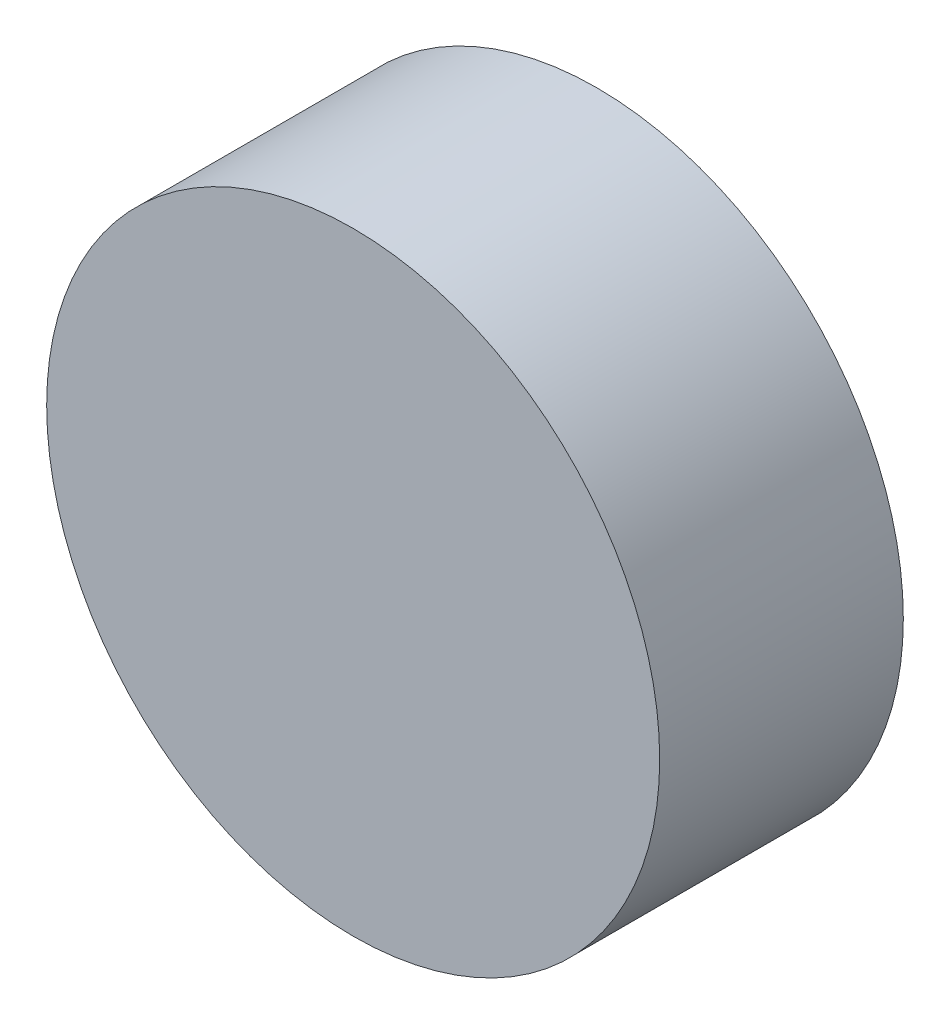
ISO-10303-21;
HEADER;
FILE_DESCRIPTION(('STEP AP214'),'2;1');
FILE_NAME('part.step','',(''),(''),'','','');
FILE_SCHEMA(('AUTOMOTIVE_DESIGN { 1 0 10303 214 1 1 1 1 }'));
ENDSEC;
DATA;
#1=APPLICATION_CONTEXT('core data for automotive mechanical design processes');
#2=APPLICATION_PROTOCOL_DEFINITION('international standard','automotive_design',2000,#1);
#3=PRODUCT_CONTEXT('',#1,'mechanical');
#4=PRODUCT('Part','Part','',(#3));
#5=PRODUCT_RELATED_PRODUCT_CATEGORY('part','',(#4));
#6=PRODUCT_DEFINITION_FORMATION('','',#4);
#7=PRODUCT_DEFINITION_CONTEXT('part definition',#1,'design');
#8=PRODUCT_DEFINITION('design','',#6,#7);
#9=PRODUCT_DEFINITION_SHAPE('','',#8);
#10=(LENGTH_UNIT() NAMED_UNIT(*) SI_UNIT(.MILLI.,.METRE.));
#11=(NAMED_UNIT(*) PLANE_ANGLE_UNIT() SI_UNIT($,.RADIAN.));
#12=(NAMED_UNIT(*) SI_UNIT($,.STERADIAN.) SOLID_ANGLE_UNIT());
#13=UNCERTAINTY_MEASURE_WITH_UNIT(LENGTH_MEASURE(1.E-05),#10,'distance_accuracy_value','');
#14=(GEOMETRIC_REPRESENTATION_CONTEXT(3) GLOBAL_UNCERTAINTY_ASSIGNED_CONTEXT((#13)) GLOBAL_UNIT_ASSIGNED_CONTEXT((#10,
#11,#12)) REPRESENTATION_CONTEXT('',''));
#15=CARTESIAN_POINT('',(0.,0.,0.));
#16=DIRECTION('',(0.,0.,1.));
#17=DIRECTION('',(1.,0.,0.));
#18=AXIS2_PLACEMENT_3D('',#15,#16,#17);
#19=CARTESIAN_POINT('',(0.,0.,23.050246));
#20=DIRECTION('',(0.,0.,-1.));
#21=DIRECTION('',(-1.,0.,0.));
#22=AXIS2_PLACEMENT_3D('',#19,#20,#21);
#23=CYLINDRICAL_SURFACE('',#22,29.);
#24=CARTESIAN_POINT('',(0.,0.,23.050246));
#25=DIRECTION('',(0.,0.,1.));
#26=DIRECTION('',(1.,0.,0.));
#27=AXIS2_PLACEMENT_3D('',#24,#25,#26);
#28=CIRCLE('',#27,29.);
#29=CARTESIAN_POINT('',(29.,0.,23.050246));
#30=VERTEX_POINT('',#29);
#31=EDGE_CURVE('E10',#30,#30,#28,.T.);
#32=ORIENTED_EDGE('',*,*,#31,.F.);
#33=EDGE_LOOP('',(#32));
#34=FACE_BOUND('',#33,.T.);
#35=CARTESIAN_POINT('',(0.,0.,0.));
#36=DIRECTION('',(0.,0.,1.));
#37=DIRECTION('',(1.,0.,0.));
#38=AXIS2_PLACEMENT_3D('',#35,#36,#37);
#39=CIRCLE('',#38,29.);
#40=CARTESIAN_POINT('',(29.,0.,0.));
#41=VERTEX_POINT('',#40);
#42=EDGE_CURVE('E40',#41,#41,#39,.T.);
#43=ORIENTED_EDGE('',*,*,#42,.T.);
#44=EDGE_LOOP('',(#43));
#45=FACE_BOUND('',#44,.T.);
#46=ADVANCED_FACE('F37',(#34,#45),#23,.T.);
#47=CARTESIAN_POINT('',(0.,0.,23.050246));
#48=DIRECTION('',(0.,0.,1.));
#49=DIRECTION('',(1.,0.,0.));
#50=AXIS2_PLACEMENT_3D('',#47,#48,#49);
#51=PLANE('',#50);
#52=ORIENTED_EDGE('',*,*,#31,.T.);
#53=EDGE_LOOP('',(#52));
#54=FACE_BOUND('',#53,.T.);
#55=ADVANCED_FACE('F54',(#54),#51,.T.);
#56=CARTESIAN_POINT('',(0.,0.,0.));
#57=DIRECTION('',(0.,0.,1.));
#58=DIRECTION('',(1.,0.,0.));
#59=AXIS2_PLACEMENT_3D('',#56,#57,#58);
#60=PLANE('',#59);
#61=ORIENTED_EDGE('',*,*,#42,.F.);
#62=EDGE_LOOP('',(#61));
#63=FACE_BOUND('',#62,.T.);
#64=ADVANCED_FACE('F52',(#63),#60,.F.);
#65=CLOSED_SHELL('',(#46,#55,#64));
#66=MANIFOLD_SOLID_BREP('B2',#65);
#67=ADVANCED_BREP_SHAPE_REPRESENTATION('',(#18,#66),#14);
#68=SHAPE_DEFINITION_REPRESENTATION(#9,#67);
ENDSEC;
END-ISO-10303-21;
